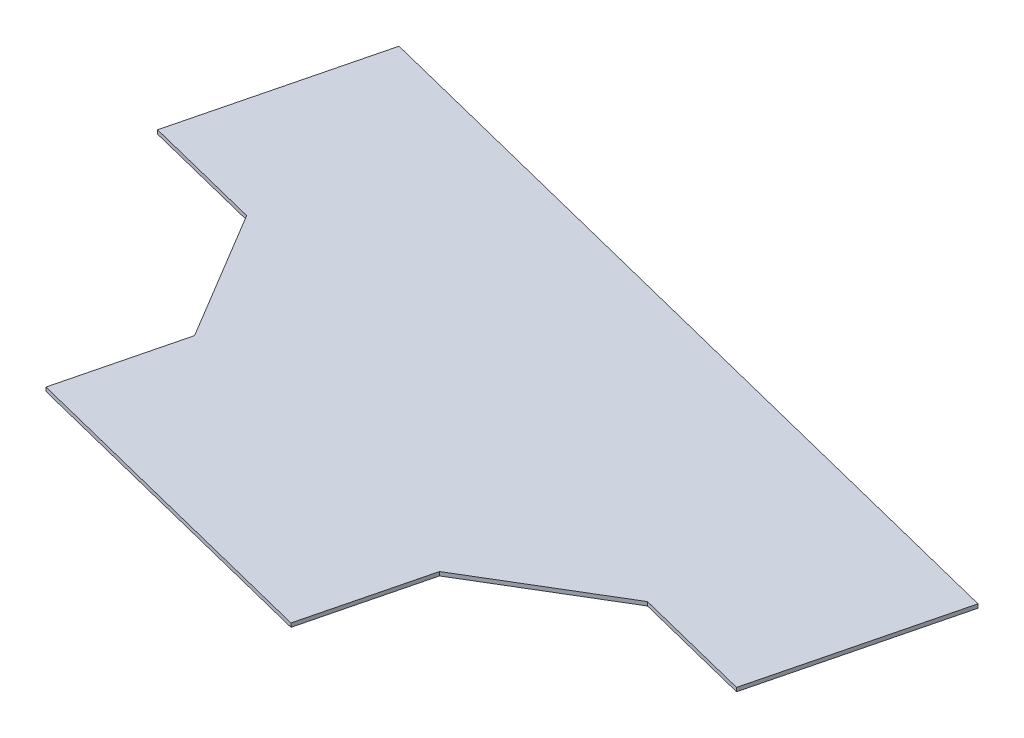
ISO-10303-21;
HEADER;
FILE_DESCRIPTION(('STEP AP214'),'2;1');
FILE_NAME('part.step','',(''),(''),'','','');
FILE_SCHEMA(('AUTOMOTIVE_DESIGN { 1 0 10303 214 1 1 1 1 }'));
ENDSEC;
DATA;
#1=APPLICATION_CONTEXT('core data for automotive mechanical design processes');
#2=APPLICATION_PROTOCOL_DEFINITION('international standard','automotive_design',2000,#1);
#3=PRODUCT_CONTEXT('',#1,'mechanical');
#4=PRODUCT('Part','Part','',(#3));
#5=PRODUCT_RELATED_PRODUCT_CATEGORY('part','',(#4));
#6=PRODUCT_DEFINITION_FORMATION('','',#4);
#7=PRODUCT_DEFINITION_CONTEXT('part definition',#1,'design');
#8=PRODUCT_DEFINITION('design','',#6,#7);
#9=PRODUCT_DEFINITION_SHAPE('','',#8);
#10=(LENGTH_UNIT() NAMED_UNIT(*) SI_UNIT(.MILLI.,.METRE.));
#11=(NAMED_UNIT(*) PLANE_ANGLE_UNIT() SI_UNIT($,.RADIAN.));
#12=(NAMED_UNIT(*) SI_UNIT($,.STERADIAN.) SOLID_ANGLE_UNIT());
#13=UNCERTAINTY_MEASURE_WITH_UNIT(LENGTH_MEASURE(1.E-05),#10,'distance_accuracy_value','');
#14=(GEOMETRIC_REPRESENTATION_CONTEXT(3) GLOBAL_UNCERTAINTY_ASSIGNED_CONTEXT((#13)) GLOBAL_UNIT_ASSIGNED_CONTEXT((#10,
#11,#12)) REPRESENTATION_CONTEXT('',''));
#15=CARTESIAN_POINT('',(0.,0.,0.));
#16=DIRECTION('',(0.,0.,1.));
#17=DIRECTION('',(1.,0.,0.));
#18=AXIS2_PLACEMENT_3D('',#15,#16,#17);
#19=CARTESIAN_POINT('',(-600.511613132669,3.175,-320.580680161453));
#20=DIRECTION('',(-0.242922687680602,0.,0.970045652436025));
#21=DIRECTION('',(0.970045652436025,0.,0.242922687680602));
#22=AXIS2_PLACEMENT_3D('',#19,#20,#21);
#23=PLANE('',#22);
#24=DIRECTION('',(-0.970045652436024,0.,-0.242922687680602));
#25=VECTOR('',#24,1.);
#26=CARTESIAN_POINT('',(-600.511613132669,0.,-320.580680161453));
#27=LINE('',#26,#25);
#28=CARTESIAN_POINT('',(40.1065357360744,0.,-160.154537217185));
#29=VERTEX_POINT('',#28);
#30=CARTESIAN_POINT('',(-600.511613132669,0.,-320.580680161453));
#31=VERTEX_POINT('',#30);
#32=EDGE_CURVE('E145',#29,#31,#27,.T.);
#33=ORIENTED_EDGE('',*,*,#32,.T.);
#34=DIRECTION('',(0.,-1.,0.));
#35=VECTOR('',#34,1.);
#36=CARTESIAN_POINT('',(-600.511613132669,3.175,-320.580680161453));
#37=LINE('',#36,#35);
#38=CARTESIAN_POINT('',(-600.511613132669,3.175,-320.580680161453));
#39=VERTEX_POINT('',#38);
#40=EDGE_CURVE('E11',#39,#31,#37,.T.);
#41=ORIENTED_EDGE('',*,*,#40,.F.);
#42=DIRECTION('',(-0.970045652436024,0.,-0.242922687680602));
#43=VECTOR('',#42,1.);
#44=CARTESIAN_POINT('',(-600.511613132669,3.175,-320.580680161453));
#45=LINE('',#44,#43);
#46=CARTESIAN_POINT('',(40.1065357360744,3.175,-160.154537217185));
#47=VERTEX_POINT('',#46);
#48=EDGE_CURVE('E163',#47,#39,#45,.T.);
#49=ORIENTED_EDGE('',*,*,#48,.F.);
#50=DIRECTION('',(0.,-1.,0.));
#51=VECTOR('',#50,1.);
#52=CARTESIAN_POINT('',(40.1065357360744,3.175,-160.154537217185));
#53=LINE('',#52,#51);
#54=EDGE_CURVE('E141',#47,#29,#53,.T.);
#55=ORIENTED_EDGE('',*,*,#54,.T.);
#56=EDGE_LOOP('',(#33,#41,#49,#55));
#57=FACE_BOUND('',#56,.T.);
#58=ADVANCED_FACE('F37',(#57),#23,.F.);
#59=CARTESIAN_POINT('',(-600.511613132669,3.175,-320.580680161453));
#60=DIRECTION('',(0.970045652436013,0.,0.242922687680646));
#61=DIRECTION('',(0.242922687680646,0.,-0.970045652436014));
#62=AXIS2_PLACEMENT_3D('',#59,#60,#61);
#63=PLANE('',#62);
#64=DIRECTION('',(-0.242922687680646,0.,0.970045652436013));
#65=VECTOR('',#64,1.);
#66=CARTESIAN_POINT('',(-600.511613132669,0.,-320.580680161453));
#67=LINE('',#66,#65);
#68=CARTESIAN_POINT('',(-640.618148868744,0.,-160.426142944267));
#69=VERTEX_POINT('',#68);
#70=EDGE_CURVE('E148',#31,#69,#67,.T.);
#71=ORIENTED_EDGE('',*,*,#70,.T.);
#72=DIRECTION('',(0.,-1.,0.));
#73=VECTOR('',#72,1.);
#74=CARTESIAN_POINT('',(-640.618148868744,3.175,-160.426142944267));
#75=LINE('',#74,#73);
#76=CARTESIAN_POINT('',(-640.618148868744,3.175,-160.426142944267));
#77=VERTEX_POINT('',#76);
#78=EDGE_CURVE('E45',#77,#69,#75,.T.);
#79=ORIENTED_EDGE('',*,*,#78,.F.);
#80=DIRECTION('',(-0.242922687680646,0.,0.970045652436013));
#81=VECTOR('',#80,1.);
#82=CARTESIAN_POINT('',(-600.511613132669,3.175,-320.580680161453));
#83=LINE('',#82,#81);
#84=EDGE_CURVE('E102',#39,#77,#83,.T.);
#85=ORIENTED_EDGE('',*,*,#84,.F.);
#86=ORIENTED_EDGE('',*,*,#40,.T.);
#87=EDGE_LOOP('',(#71,#79,#85,#86));
#88=FACE_BOUND('',#87,.T.);
#89=ADVANCED_FACE('F212',(#88),#63,.F.);
#90=CARTESIAN_POINT('',(-640.618148868744,3.175,-160.426142944267));
#91=DIRECTION('',(0.242922687680601,0.,-0.970045652436025));
#92=DIRECTION('',(-0.970045652436025,0.,-0.242922687680601));
#93=AXIS2_PLACEMENT_3D('',#90,#91,#92);
#94=PLANE('',#93);
#95=DIRECTION('',(0.970045652436025,0.,0.242922687680601));
#96=VECTOR('',#95,1.);
#97=CARTESIAN_POINT('',(-640.618148868744,0.,-160.426142944267));
#98=LINE('',#97,#96);
#99=CARTESIAN_POINT('',(-542.061510581244,0.,-135.745197875918));
#100=VERTEX_POINT('',#99);
#101=EDGE_CURVE('E150',#69,#100,#98,.T.);
#102=ORIENTED_EDGE('',*,*,#101,.T.);
#103=DIRECTION('',(0.,-1.,0.));
#104=VECTOR('',#103,1.);
#105=CARTESIAN_POINT('',(-542.061510581244,3.175,-135.745197875918));
#106=LINE('',#105,#104);
#107=CARTESIAN_POINT('',(-542.061510581244,3.175,-135.745197875918));
#108=VERTEX_POINT('',#107);
#109=EDGE_CURVE('E176',#108,#100,#106,.T.);
#110=ORIENTED_EDGE('',*,*,#109,.F.);
#111=DIRECTION('',(0.970045652436025,0.,0.242922687680601));
#112=VECTOR('',#111,1.);
#113=CARTESIAN_POINT('',(-640.618148868744,3.175,-160.426142944267));
#114=LINE('',#113,#112);
#115=EDGE_CURVE('E184',#77,#108,#114,.T.);
#116=ORIENTED_EDGE('',*,*,#115,.F.);
#117=ORIENTED_EDGE('',*,*,#78,.T.);
#118=EDGE_LOOP('',(#102,#110,#116,#117));
#119=FACE_BOUND('',#118,.T.);
#120=ADVANCED_FACE('F182',(#119),#94,.F.);
#121=CARTESIAN_POINT('',(-542.061510581244,3.175,-135.745197875918));
#122=DIRECTION('',(0.85769813866106,0.,-0.514153579135021));
#123=DIRECTION('',(-0.514153579135021,0.,-0.85769813866106));
#124=AXIS2_PLACEMENT_3D('',#121,#122,#123);
#125=PLANE('',#124);
#126=DIRECTION('',(0.514153579135021,0.,0.85769813866106));
#127=VECTOR('',#126,1.);
#128=CARTESIAN_POINT('',(-542.061510581244,0.,-135.745197875918));
#129=LINE('',#128,#127);
#130=CARTESIAN_POINT('',(-477.420279014488,0.,-27.9123124395505));
#131=VERTEX_POINT('',#130);
#132=EDGE_CURVE('E152',#100,#131,#129,.T.);
#133=ORIENTED_EDGE('',*,*,#132,.T.);
#134=DIRECTION('',(0.,-1.,0.));
#135=VECTOR('',#134,1.);
#136=CARTESIAN_POINT('',(-477.420279014488,3.175,-27.9123124395505));
#137=LINE('',#136,#135);
#138=CARTESIAN_POINT('',(-477.420279014488,3.175,-27.9123124395505));
#139=VERTEX_POINT('',#138);
#140=EDGE_CURVE('E173',#139,#131,#137,.T.);
#141=ORIENTED_EDGE('',*,*,#140,.F.);
#142=DIRECTION('',(0.514153579135021,0.,0.85769813866106));
#143=VECTOR('',#142,1.);
#144=CARTESIAN_POINT('',(-542.061510581244,3.175,-135.745197875918));
#145=LINE('',#144,#143);
#146=EDGE_CURVE('E202',#108,#139,#145,.T.);
#147=ORIENTED_EDGE('',*,*,#146,.F.);
#148=ORIENTED_EDGE('',*,*,#109,.T.);
#149=EDGE_LOOP('',(#133,#141,#147,#148));
#150=FACE_BOUND('',#149,.T.);
#151=ADVANCED_FACE('F193',(#150),#125,.F.);
#152=CARTESIAN_POINT('',(-477.420279014488,3.175,-27.9123124395505));
#153=DIRECTION('',(0.970045652436025,0.,0.2429226876806));
#154=DIRECTION('',(0.2429226876806,0.,-0.970045652436025));
#155=AXIS2_PLACEMENT_3D('',#152,#153,#154);
#156=PLANE('',#155);
#157=DIRECTION('',(-0.2429226876806,0.,0.970045652436025));
#158=VECTOR('',#157,1.);
#159=CARTESIAN_POINT('',(-477.420279014488,0.,-27.9123124395505));
#160=LINE('',#159,#158);
#161=CARTESIAN_POINT('',(-502.101224082837,0.,70.6443258479497));
#162=VERTEX_POINT('',#161);
#163=EDGE_CURVE('E154',#131,#162,#160,.T.);
#164=ORIENTED_EDGE('',*,*,#163,.T.);
#165=DIRECTION('',(0.,-1.,0.));
#166=VECTOR('',#165,1.);
#167=CARTESIAN_POINT('',(-502.101224082837,3.175,70.6443258479497));
#168=LINE('',#167,#166);
#169=CARTESIAN_POINT('',(-502.101224082837,3.175,70.6443258479497));
#170=VERTEX_POINT('',#169);
#171=EDGE_CURVE('E170',#170,#162,#168,.T.);
#172=ORIENTED_EDGE('',*,*,#171,.F.);
#173=DIRECTION('',(-0.2429226876806,0.,0.970045652436025));
#174=VECTOR('',#173,1.);
#175=CARTESIAN_POINT('',(-477.420279014488,3.175,-27.9123124395505));
#176=LINE('',#175,#174);
#177=EDGE_CURVE('E199',#139,#170,#176,.T.);
#178=ORIENTED_EDGE('',*,*,#177,.F.);
#179=ORIENTED_EDGE('',*,*,#140,.T.);
#180=EDGE_LOOP('',(#164,#172,#178,#179));
#181=FACE_BOUND('',#180,.T.);
#182=ADVANCED_FACE('F197',(#181),#156,.F.);
#183=CARTESIAN_POINT('',(-502.101224082837,3.175,70.6443258479497));
#184=DIRECTION('',(0.242922687680604,0.,-0.970045652436024));
#185=DIRECTION('',(-0.970045652436024,0.,-0.242922687680604));
#186=AXIS2_PLACEMENT_3D('',#183,#184,#185);
#187=PLANE('',#186);
#188=DIRECTION('',(0.970045652436024,0.,0.242922687680604));
#189=VECTOR('',#188,1.);
#190=CARTESIAN_POINT('',(-502.101224082837,0.,70.6443258479497));
#191=LINE('',#190,#189);
#192=CARTESIAN_POINT('',(-231.070468792217,0.,138.516924785909));
#193=VERTEX_POINT('',#192);
#194=EDGE_CURVE('E156',#162,#193,#191,.T.);
#195=ORIENTED_EDGE('',*,*,#194,.T.);
#196=DIRECTION('',(0.,-1.,0.));
#197=VECTOR('',#196,1.);
#198=CARTESIAN_POINT('',(-231.070468792217,3.175,138.516924785909));
#199=LINE('',#198,#197);
#200=CARTESIAN_POINT('',(-231.070468792217,3.175,138.516924785909));
#201=VERTEX_POINT('',#200);
#202=EDGE_CURVE('E167',#201,#193,#199,.T.);
#203=ORIENTED_EDGE('',*,*,#202,.F.);
#204=DIRECTION('',(0.970045652436024,0.,0.242922687680604));
#205=VECTOR('',#204,1.);
#206=CARTESIAN_POINT('',(-502.101224082837,3.175,70.6443258479497));
#207=LINE('',#206,#205);
#208=EDGE_CURVE('E201',#170,#201,#207,.T.);
#209=ORIENTED_EDGE('',*,*,#208,.F.);
#210=ORIENTED_EDGE('',*,*,#171,.T.);
#211=EDGE_LOOP('',(#195,#203,#209,#210));
#212=FACE_BOUND('',#211,.T.);
#213=ADVANCED_FACE('F224',(#212),#187,.F.);
#214=CARTESIAN_POINT('',(-231.070468792217,3.175,138.516924785909));
#215=DIRECTION('',(-0.970045652436025,0.,-0.2429226876806));
#216=DIRECTION('',(-0.2429226876806,0.,0.970045652436025));
#217=AXIS2_PLACEMENT_3D('',#214,#215,#216);
#218=PLANE('',#217);
#219=DIRECTION('',(0.2429226876806,0.,-0.970045652436025));
#220=VECTOR('',#219,1.);
#221=CARTESIAN_POINT('',(-231.070468792217,0.,138.516924785909));
#222=LINE('',#221,#220);
#223=CARTESIAN_POINT('',(-206.389523723868,0.,39.9602864984092));
#224=VERTEX_POINT('',#223);
#225=EDGE_CURVE('E158',#193,#224,#222,.T.);
#226=ORIENTED_EDGE('',*,*,#225,.T.);
#227=DIRECTION('',(0.,-1.,0.));
#228=VECTOR('',#227,1.);
#229=CARTESIAN_POINT('',(-206.389523723868,3.175,39.9602864984092));
#230=LINE('',#229,#228);
#231=CARTESIAN_POINT('',(-206.389523723868,3.175,39.9602864984092));
#232=VERTEX_POINT('',#231);
#233=EDGE_CURVE('E136',#232,#224,#230,.T.);
#234=ORIENTED_EDGE('',*,*,#233,.F.);
#235=DIRECTION('',(0.2429226876806,0.,-0.970045652436025));
#236=VECTOR('',#235,1.);
#237=CARTESIAN_POINT('',(-231.070468792217,3.175,138.516924785909));
#238=LINE('',#237,#236);
#239=EDGE_CURVE('E127',#201,#232,#238,.T.);
#240=ORIENTED_EDGE('',*,*,#239,.F.);
#241=ORIENTED_EDGE('',*,*,#202,.T.);
#242=EDGE_LOOP('',(#226,#234,#240,#241));
#243=FACE_BOUND('',#242,.T.);
#244=ADVANCED_FACE('F227',(#243),#218,.F.);
#245=CARTESIAN_POINT('',(-206.389523723868,3.175,39.9602864984092));
#246=DIRECTION('',(-0.514153579135033,0.,-0.857698138661053));
#247=DIRECTION('',(-0.857698138661053,0.,0.514153579135033));
#248=AXIS2_PLACEMENT_3D('',#245,#246,#247);
#249=PLANE('',#248);
#250=DIRECTION('',(0.857698138661053,0.,-0.514153579135033));
#251=VECTOR('',#250,1.);
#252=CARTESIAN_POINT('',(-206.389523723868,0.,39.9602864984092));
#253=LINE('',#252,#251);
#254=CARTESIAN_POINT('',(-98.5566382875002,0.,-24.6809450683489));
#255=VERTEX_POINT('',#254);
#256=EDGE_CURVE('E135',#224,#255,#253,.T.);
#257=ORIENTED_EDGE('',*,*,#256,.T.);
#258=DIRECTION('',(0.,-1.,0.));
#259=VECTOR('',#258,1.);
#260=CARTESIAN_POINT('',(-98.5566382875002,3.175,-24.6809450683489));
#261=LINE('',#260,#259);
#262=CARTESIAN_POINT('',(-98.5566382875002,3.175,-24.6809450683489));
#263=VERTEX_POINT('',#262);
#264=EDGE_CURVE('E132',#263,#255,#261,.T.);
#265=ORIENTED_EDGE('',*,*,#264,.F.);
#266=DIRECTION('',(0.857698138661053,0.,-0.514153579135033));
#267=VECTOR('',#266,1.);
#268=CARTESIAN_POINT('',(-206.389523723868,3.175,39.9602864984092));
#269=LINE('',#268,#267);
#270=EDGE_CURVE('E121',#232,#263,#269,.T.);
#271=ORIENTED_EDGE('',*,*,#270,.F.);
#272=ORIENTED_EDGE('',*,*,#233,.T.);
#273=EDGE_LOOP('',(#257,#265,#271,#272));
#274=FACE_BOUND('',#273,.T.);
#275=ADVANCED_FACE('F133',(#274),#249,.F.);
#276=CARTESIAN_POINT('',(-98.5566382875002,3.175,-24.6809450683489));
#277=DIRECTION('',(0.2429226876806,0.,-0.970045652436025));
#278=DIRECTION('',(-0.970045652436025,0.,-0.2429226876806));
#279=AXIS2_PLACEMENT_3D('',#276,#277,#278);
#280=PLANE('',#279);
#281=DIRECTION('',(0.970045652436025,0.,0.2429226876806));
#282=VECTOR('',#281,1.);
#283=CARTESIAN_POINT('',(-98.5566382875002,0.,-24.6809450683489));
#284=LINE('',#283,#282);
#285=CARTESIAN_POINT('',(0.,0.,0.));
#286=VERTEX_POINT('',#285);
#287=EDGE_CURVE('E88',#255,#286,#284,.T.);
#288=ORIENTED_EDGE('',*,*,#287,.T.);
#289=DIRECTION('',(0.,-1.,0.));
#290=VECTOR('',#289,1.);
#291=CARTESIAN_POINT('',(0.,3.175,0.));
#292=LINE('',#291,#290);
#293=CARTESIAN_POINT('',(0.,3.175,0.));
#294=VERTEX_POINT('',#293);
#295=EDGE_CURVE('E137',#294,#286,#292,.T.);
#296=ORIENTED_EDGE('',*,*,#295,.F.);
#297=DIRECTION('',(0.970045652436025,0.,0.2429226876806));
#298=VECTOR('',#297,1.);
#299=CARTESIAN_POINT('',(-98.5566382875002,3.175,-24.6809450683489));
#300=LINE('',#299,#298);
#301=EDGE_CURVE('E125',#263,#294,#300,.T.);
#302=ORIENTED_EDGE('',*,*,#301,.F.);
#303=ORIENTED_EDGE('',*,*,#264,.T.);
#304=EDGE_LOOP('',(#288,#296,#302,#303));
#305=FACE_BOUND('',#304,.T.);
#306=ADVANCED_FACE('F139',(#305),#280,.F.);
#307=CARTESIAN_POINT('',(0.,3.175,0.));
#308=DIRECTION('',(-0.970045652436014,0.,-0.242922687680646));
#309=DIRECTION('',(-0.242922687680646,0.,0.970045652436014));
#310=AXIS2_PLACEMENT_3D('',#307,#308,#309);
#311=PLANE('',#310);
#312=DIRECTION('',(0.242922687680646,0.,-0.970045652436014));
#313=VECTOR('',#312,1.);
#314=CARTESIAN_POINT('',(0.,0.,0.));
#315=LINE('',#314,#313);
#316=EDGE_CURVE('E94',#286,#29,#315,.T.);
#317=ORIENTED_EDGE('',*,*,#316,.T.);
#318=ORIENTED_EDGE('',*,*,#54,.F.);
#319=DIRECTION('',(0.242922687680646,0.,-0.970045652436014));
#320=VECTOR('',#319,1.);
#321=CARTESIAN_POINT('',(0.,3.175,0.));
#322=LINE('',#321,#320);
#323=EDGE_CURVE('E53',#294,#47,#322,.T.);
#324=ORIENTED_EDGE('',*,*,#323,.F.);
#325=ORIENTED_EDGE('',*,*,#295,.T.);
#326=EDGE_LOOP('',(#317,#318,#324,#325));
#327=FACE_BOUND('',#326,.T.);
#328=ADVANCED_FACE('F236',(#327),#311,.F.);
#329=CARTESIAN_POINT('',(0.,3.175,0.));
#330=DIRECTION('',(0.,1.,0.));
#331=DIRECTION('',(0.,0.,1.));
#332=AXIS2_PLACEMENT_3D('',#329,#330,#331);
#333=PLANE('',#332);
#334=ORIENTED_EDGE('',*,*,#48,.T.);
#335=ORIENTED_EDGE('',*,*,#84,.T.);
#336=ORIENTED_EDGE('',*,*,#115,.T.);
#337=ORIENTED_EDGE('',*,*,#146,.T.);
#338=ORIENTED_EDGE('',*,*,#177,.T.);
#339=ORIENTED_EDGE('',*,*,#208,.T.);
#340=ORIENTED_EDGE('',*,*,#239,.T.);
#341=ORIENTED_EDGE('',*,*,#270,.T.);
#342=ORIENTED_EDGE('',*,*,#301,.T.);
#343=ORIENTED_EDGE('',*,*,#323,.T.);
#344=EDGE_LOOP('',(#334,#335,#336,#337,#338,#339,#340,#341,#342,#343));
#345=FACE_BOUND('',#344,.T.);
#346=ADVANCED_FACE('F123',(#345),#333,.T.);
#347=CARTESIAN_POINT('',(0.,0.,0.));
#348=DIRECTION('',(0.,1.,0.));
#349=DIRECTION('',(0.,0.,1.));
#350=AXIS2_PLACEMENT_3D('',#347,#348,#349);
#351=PLANE('',#350);
#352=ORIENTED_EDGE('',*,*,#32,.F.);
#353=ORIENTED_EDGE('',*,*,#316,.F.);
#354=ORIENTED_EDGE('',*,*,#287,.F.);
#355=ORIENTED_EDGE('',*,*,#256,.F.);
#356=ORIENTED_EDGE('',*,*,#225,.F.);
#357=ORIENTED_EDGE('',*,*,#194,.F.);
#358=ORIENTED_EDGE('',*,*,#163,.F.);
#359=ORIENTED_EDGE('',*,*,#132,.F.);
#360=ORIENTED_EDGE('',*,*,#101,.F.);
#361=ORIENTED_EDGE('',*,*,#70,.F.);
#362=EDGE_LOOP('',(#352,#353,#354,#355,#356,#357,#358,#359,#360,#361));
#363=FACE_BOUND('',#362,.T.);
#364=ADVANCED_FACE('F188',(#363),#351,.F.);
#365=CLOSED_SHELL('',(#58,#89,#120,#151,#182,#213,#244,#275,#306,#328,#346,#364));
#366=MANIFOLD_SOLID_BREP('B2',#365);
#367=ADVANCED_BREP_SHAPE_REPRESENTATION('',(#18,#366),#14);
#368=SHAPE_DEFINITION_REPRESENTATION(#9,#367);
ENDSEC;
END-ISO-10303-21;
